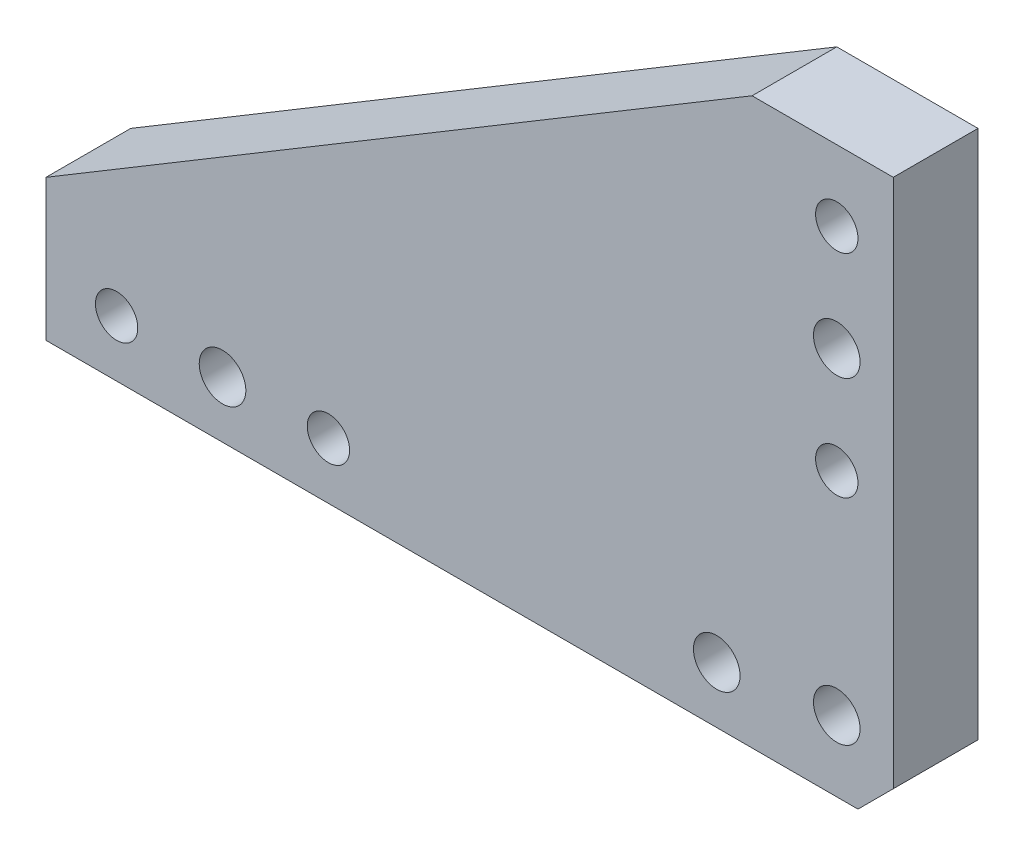
ISO-10303-21;
HEADER;
FILE_DESCRIPTION(('STEP AP214'),'2;1');
FILE_NAME('part.step','',(''),(''),'','','');
FILE_SCHEMA(('AUTOMOTIVE_DESIGN { 1 0 10303 214 1 1 1 1 }'));
ENDSEC;
DATA;
#1=APPLICATION_CONTEXT('core data for automotive mechanical design processes');
#2=APPLICATION_PROTOCOL_DEFINITION('international standard','automotive_design',2000,#1);
#3=PRODUCT_CONTEXT('',#1,'mechanical');
#4=PRODUCT('Part','Part','',(#3));
#5=PRODUCT_RELATED_PRODUCT_CATEGORY('part','',(#4));
#6=PRODUCT_DEFINITION_FORMATION('','',#4);
#7=PRODUCT_DEFINITION_CONTEXT('part definition',#1,'design');
#8=PRODUCT_DEFINITION('design','',#6,#7);
#9=PRODUCT_DEFINITION_SHAPE('','',#8);
#10=(LENGTH_UNIT() NAMED_UNIT(*) SI_UNIT(.MILLI.,.METRE.));
#11=(NAMED_UNIT(*) PLANE_ANGLE_UNIT() SI_UNIT($,.RADIAN.));
#12=(NAMED_UNIT(*) SI_UNIT($,.STERADIAN.) SOLID_ANGLE_UNIT());
#13=UNCERTAINTY_MEASURE_WITH_UNIT(LENGTH_MEASURE(1.E-05),#10,'distance_accuracy_value','');
#14=(GEOMETRIC_REPRESENTATION_CONTEXT(3) GLOBAL_UNCERTAINTY_ASSIGNED_CONTEXT((#13)) GLOBAL_UNIT_ASSIGNED_CONTEXT((#10,
#11,#12)) REPRESENTATION_CONTEXT('',''));
#15=CARTESIAN_POINT('',(0.,0.,0.));
#16=DIRECTION('',(0.,0.,1.));
#17=DIRECTION('',(1.,0.,0.));
#18=AXIS2_PLACEMENT_3D('',#15,#16,#17);
#19=CARTESIAN_POINT('',(0.,0.,12.));
#20=DIRECTION('',(0.,0.,1.));
#21=DIRECTION('',(1.,0.,0.));
#22=AXIS2_PLACEMENT_3D('',#19,#20,#21);
#23=PLANE('',#22);
#24=CARTESIAN_POINT('',(52.,15.,12.));
#25=DIRECTION('',(0.,0.,-1.));
#26=DIRECTION('',(-1.,0.,0.));
#27=AXIS2_PLACEMENT_3D('',#24,#25,#26);
#28=CIRCLE('',#27,3.3);
#29=CARTESIAN_POINT('',(48.7,15.,12.));
#30=VERTEX_POINT('',#29);
#31=EDGE_CURVE('E183',#30,#30,#28,.T.);
#32=ORIENTED_EDGE('',*,*,#31,.T.);
#33=EDGE_LOOP('',(#32));
#34=FACE_BOUND('',#33,.T.);
#35=CARTESIAN_POINT('',(52.,-30.,12.));
#36=DIRECTION('',(0.,0.,-1.));
#37=DIRECTION('',(-1.,0.,0.));
#38=AXIS2_PLACEMENT_3D('',#35,#36,#37);
#39=CIRCLE('',#38,3.3);
#40=CARTESIAN_POINT('',(48.7,-30.,12.));
#41=VERTEX_POINT('',#40);
#42=EDGE_CURVE('E177',#41,#41,#39,.T.);
#43=ORIENTED_EDGE('',*,*,#42,.T.);
#44=EDGE_LOOP('',(#43));
#45=FACE_BOUND('',#44,.T.);
#46=CARTESIAN_POINT('',(35.,-32.,12.));
#47=DIRECTION('',(0.,0.,-1.));
#48=DIRECTION('',(-1.,0.,0.));
#49=AXIS2_PLACEMENT_3D('',#46,#47,#48);
#50=CIRCLE('',#49,3.3);
#51=CARTESIAN_POINT('',(31.7,-32.,12.));
#52=VERTEX_POINT('',#51);
#53=EDGE_CURVE('E171',#52,#52,#50,.T.);
#54=ORIENTED_EDGE('',*,*,#53,.T.);
#55=EDGE_LOOP('',(#54));
#56=FACE_BOUND('',#55,.T.);
#57=DIRECTION('',(1.,0.,0.));
#58=VECTOR('',#57,1.);
#59=CARTESIAN_POINT('',(60.,-40.,12.));
#60=LINE('',#59,#58);
#61=CARTESIAN_POINT('',(-60.,-40.,12.));
#62=VERTEX_POINT('',#61);
#63=CARTESIAN_POINT('',(55.,-40.,12.));
#64=VERTEX_POINT('',#63);
#65=EDGE_CURVE('E88',#62,#64,#60,.T.);
#66=ORIENTED_EDGE('',*,*,#65,.T.);
#67=DIRECTION('',(-0.707106781186548,-0.707106781186547,0.));
#68=VECTOR('',#67,1.);
#69=CARTESIAN_POINT('',(47.4999999999999,-47.5,12.));
#70=LINE('',#69,#68);
#71=CARTESIAN_POINT('',(60.,-35.,12.));
#72=VERTEX_POINT('',#71);
#73=EDGE_CURVE('E11',#64,#72,#70,.F.);
#74=ORIENTED_EDGE('',*,*,#73,.T.);
#75=DIRECTION('',(0.,1.,0.));
#76=VECTOR('',#75,1.);
#77=CARTESIAN_POINT('',(60.,-40.,12.));
#78=LINE('',#77,#76);
#79=CARTESIAN_POINT('',(60.,40.,12.));
#80=VERTEX_POINT('',#79);
#81=EDGE_CURVE('E102',#72,#80,#78,.T.);
#82=ORIENTED_EDGE('',*,*,#81,.T.);
#83=DIRECTION('',(-1.,0.,0.));
#84=VECTOR('',#83,1.);
#85=CARTESIAN_POINT('',(60.,40.,12.));
#86=LINE('',#85,#84);
#87=CARTESIAN_POINT('',(40.0000000000006,40.,12.));
#88=VERTEX_POINT('',#87);
#89=EDGE_CURVE('E113',#80,#88,#86,.T.);
#90=ORIENTED_EDGE('',*,*,#89,.T.);
#91=DIRECTION('',(0.857492925712545,0.514495755427525,0.));
#92=VECTOR('',#91,1.);
#93=CARTESIAN_POINT('',(-7.05882352941164,11.7647058823528,12.));
#94=LINE('',#93,#92);
#95=CARTESIAN_POINT('',(-60.,-20.0000000000001,12.));
#96=VERTEX_POINT('',#95);
#97=EDGE_CURVE('E92',#88,#96,#94,.F.);
#98=ORIENTED_EDGE('',*,*,#97,.T.);
#99=DIRECTION('',(0.,-1.,0.));
#100=VECTOR('',#99,1.);
#101=CARTESIAN_POINT('',(-60.,-40.,12.));
#102=LINE('',#101,#100);
#103=EDGE_CURVE('E86',#96,#62,#102,.T.);
#104=ORIENTED_EDGE('',*,*,#103,.T.);
#105=EDGE_LOOP('',(#66,#74,#82,#90,#98,#104));
#106=FACE_BOUND('',#105,.T.);
#107=CARTESIAN_POINT('',(52.,0.,12.));
#108=DIRECTION('',(0.,0.,-1.));
#109=DIRECTION('',(-1.,0.,0.));
#110=AXIS2_PLACEMENT_3D('',#107,#108,#109);
#111=CIRCLE('',#110,3.);
#112=CARTESIAN_POINT('',(49.,0.,12.));
#113=VERTEX_POINT('',#112);
#114=EDGE_CURVE('E139',#113,#113,#111,.T.);
#115=ORIENTED_EDGE('',*,*,#114,.T.);
#116=EDGE_LOOP('',(#115));
#117=FACE_BOUND('',#116,.T.);
#118=CARTESIAN_POINT('',(52.,30.,12.));
#119=DIRECTION('',(0.,0.,-1.));
#120=DIRECTION('',(-1.,0.,0.));
#121=AXIS2_PLACEMENT_3D('',#118,#119,#120);
#122=CIRCLE('',#121,3.);
#123=CARTESIAN_POINT('',(49.,30.,12.));
#124=VERTEX_POINT('',#123);
#125=EDGE_CURVE('E147',#124,#124,#122,.T.);
#126=ORIENTED_EDGE('',*,*,#125,.T.);
#127=EDGE_LOOP('',(#126));
#128=FACE_BOUND('',#127,.T.);
#129=CARTESIAN_POINT('',(-20.,-32.,12.));
#130=DIRECTION('',(0.,0.,-1.));
#131=DIRECTION('',(-1.,0.,0.));
#132=AXIS2_PLACEMENT_3D('',#129,#130,#131);
#133=CIRCLE('',#132,3.);
#134=CARTESIAN_POINT('',(-23.,-32.,12.));
#135=VERTEX_POINT('',#134);
#136=EDGE_CURVE('E153',#135,#135,#133,.T.);
#137=ORIENTED_EDGE('',*,*,#136,.T.);
#138=EDGE_LOOP('',(#137));
#139=FACE_BOUND('',#138,.T.);
#140=CARTESIAN_POINT('',(-50.,-32.,12.));
#141=DIRECTION('',(0.,0.,-1.));
#142=DIRECTION('',(-1.,0.,0.));
#143=AXIS2_PLACEMENT_3D('',#140,#141,#142);
#144=CIRCLE('',#143,3.);
#145=CARTESIAN_POINT('',(-53.,-32.,12.));
#146=VERTEX_POINT('',#145);
#147=EDGE_CURVE('E159',#146,#146,#144,.T.);
#148=ORIENTED_EDGE('',*,*,#147,.T.);
#149=EDGE_LOOP('',(#148));
#150=FACE_BOUND('',#149,.T.);
#151=CARTESIAN_POINT('',(-35.,-32.,12.));
#152=DIRECTION('',(0.,0.,-1.));
#153=DIRECTION('',(-1.,0.,0.));
#154=AXIS2_PLACEMENT_3D('',#151,#152,#153);
#155=CIRCLE('',#154,3.3);
#156=CARTESIAN_POINT('',(-38.3,-32.,12.));
#157=VERTEX_POINT('',#156);
#158=EDGE_CURVE('E165',#157,#157,#155,.T.);
#159=ORIENTED_EDGE('',*,*,#158,.T.);
#160=EDGE_LOOP('',(#159));
#161=FACE_BOUND('',#160,.T.);
#162=ADVANCED_FACE('F34',(#34,#45,#56,#106,#117,#128,#139,#150,#161),#23,.T.);
#163=CARTESIAN_POINT('',(-60.,-40.,12.));
#164=DIRECTION('',(1.,0.,0.));
#165=DIRECTION('',(0.,0.,-1.));
#166=AXIS2_PLACEMENT_3D('',#163,#164,#165);
#167=PLANE('',#166);
#168=ORIENTED_EDGE('',*,*,#103,.F.);
#169=DIRECTION('',(0.,0.,-1.));
#170=VECTOR('',#169,1.);
#171=CARTESIAN_POINT('',(-60.,-20.0000000000001,12.));
#172=LINE('',#171,#170);
#173=CARTESIAN_POINT('',(-60.,-20.0000000000001,0.));
#174=VERTEX_POINT('',#173);
#175=EDGE_CURVE('E107',#96,#174,#172,.T.);
#176=ORIENTED_EDGE('',*,*,#175,.T.);
#177=DIRECTION('',(0.,-1.,0.));
#178=VECTOR('',#177,1.);
#179=CARTESIAN_POINT('',(-60.,-40.,0.));
#180=LINE('',#179,#178);
#181=CARTESIAN_POINT('',(-60.,-40.,0.));
#182=VERTEX_POINT('',#181);
#183=EDGE_CURVE('E106',#174,#182,#180,.T.);
#184=ORIENTED_EDGE('',*,*,#183,.T.);
#185=DIRECTION('',(0.,0.,-1.));
#186=VECTOR('',#185,1.);
#187=CARTESIAN_POINT('',(-60.,-40.,12.));
#188=LINE('',#187,#186);
#189=EDGE_CURVE('E101',#62,#182,#188,.T.);
#190=ORIENTED_EDGE('',*,*,#189,.F.);
#191=EDGE_LOOP('',(#168,#176,#184,#190));
#192=FACE_BOUND('',#191,.T.);
#193=ADVANCED_FACE('F104',(#192),#167,.F.);
#194=CARTESIAN_POINT('',(60.,-40.,12.));
#195=DIRECTION('',(0.,1.,0.));
#196=DIRECTION('',(-1.,0.,0.));
#197=AXIS2_PLACEMENT_3D('',#194,#195,#196);
#198=PLANE('',#197);
#199=DIRECTION('',(1.,0.,0.));
#200=VECTOR('',#199,1.);
#201=CARTESIAN_POINT('',(60.,-40.,0.));
#202=LINE('',#201,#200);
#203=CARTESIAN_POINT('',(55.,-40.,0.));
#204=VERTEX_POINT('',#203);
#205=EDGE_CURVE('E134',#182,#204,#202,.T.);
#206=ORIENTED_EDGE('',*,*,#205,.T.);
#207=DIRECTION('',(0.,0.,1.));
#208=VECTOR('',#207,1.);
#209=CARTESIAN_POINT('',(55.,-40.,12.));
#210=LINE('',#209,#208);
#211=EDGE_CURVE('E42',#204,#64,#210,.T.);
#212=ORIENTED_EDGE('',*,*,#211,.T.);
#213=ORIENTED_EDGE('',*,*,#65,.F.);
#214=ORIENTED_EDGE('',*,*,#189,.T.);
#215=EDGE_LOOP('',(#206,#212,#213,#214));
#216=FACE_BOUND('',#215,.T.);
#217=ADVANCED_FACE('F100',(#216),#198,.F.);
#218=CARTESIAN_POINT('',(60.,-40.,12.));
#219=DIRECTION('',(-1.,0.,0.));
#220=DIRECTION('',(0.,0.,1.));
#221=AXIS2_PLACEMENT_3D('',#218,#219,#220);
#222=PLANE('',#221);
#223=ORIENTED_EDGE('',*,*,#81,.F.);
#224=DIRECTION('',(0.,0.,-1.));
#225=VECTOR('',#224,1.);
#226=CARTESIAN_POINT('',(60.,-35.,12.));
#227=LINE('',#226,#225);
#228=CARTESIAN_POINT('',(60.,-35.,0.));
#229=VERTEX_POINT('',#228);
#230=EDGE_CURVE('E121',#72,#229,#227,.T.);
#231=ORIENTED_EDGE('',*,*,#230,.T.);
#232=DIRECTION('',(0.,1.,0.));
#233=VECTOR('',#232,1.);
#234=CARTESIAN_POINT('',(60.,-40.,0.));
#235=LINE('',#234,#233);
#236=CARTESIAN_POINT('',(60.,40.,0.));
#237=VERTEX_POINT('',#236);
#238=EDGE_CURVE('E129',#229,#237,#235,.T.);
#239=ORIENTED_EDGE('',*,*,#238,.T.);
#240=DIRECTION('',(0.,0.,-1.));
#241=VECTOR('',#240,1.);
#242=CARTESIAN_POINT('',(60.,40.,12.));
#243=LINE('',#242,#241);
#244=EDGE_CURVE('E108',#80,#237,#243,.T.);
#245=ORIENTED_EDGE('',*,*,#244,.F.);
#246=EDGE_LOOP('',(#223,#231,#239,#245));
#247=FACE_BOUND('',#246,.T.);
#248=ADVANCED_FACE('F127',(#247),#222,.F.);
#249=CARTESIAN_POINT('',(60.,40.,12.));
#250=DIRECTION('',(0.,-1.,0.));
#251=DIRECTION('',(1.,0.,0.));
#252=AXIS2_PLACEMENT_3D('',#249,#250,#251);
#253=PLANE('',#252);
#254=DIRECTION('',(-1.,0.,0.));
#255=VECTOR('',#254,1.);
#256=CARTESIAN_POINT('',(60.,40.,0.));
#257=LINE('',#256,#255);
#258=CARTESIAN_POINT('',(40.0000000000006,40.,0.));
#259=VERTEX_POINT('',#258);
#260=EDGE_CURVE('E97',#237,#259,#257,.T.);
#261=ORIENTED_EDGE('',*,*,#260,.T.);
#262=DIRECTION('',(0.,0.,1.));
#263=VECTOR('',#262,1.);
#264=CARTESIAN_POINT('',(40.0000000000006,40.,12.));
#265=LINE('',#264,#263);
#266=EDGE_CURVE('E118',#259,#88,#265,.T.);
#267=ORIENTED_EDGE('',*,*,#266,.T.);
#268=ORIENTED_EDGE('',*,*,#89,.F.);
#269=ORIENTED_EDGE('',*,*,#244,.T.);
#270=EDGE_LOOP('',(#261,#267,#268,#269));
#271=FACE_BOUND('',#270,.T.);
#272=ADVANCED_FACE('F195',(#271),#253,.F.);
#273=CARTESIAN_POINT('',(0.,0.,0.));
#274=DIRECTION('',(0.,0.,1.));
#275=DIRECTION('',(1.,0.,0.));
#276=AXIS2_PLACEMENT_3D('',#273,#274,#275);
#277=PLANE('',#276);
#278=CARTESIAN_POINT('',(52.,15.,0.));
#279=DIRECTION('',(0.,0.,-1.));
#280=DIRECTION('',(-1.,0.,0.));
#281=AXIS2_PLACEMENT_3D('',#278,#279,#280);
#282=CIRCLE('',#281,3.3);
#283=CARTESIAN_POINT('',(48.7,15.,0.));
#284=VERTEX_POINT('',#283);
#285=EDGE_CURVE('E186',#284,#284,#282,.T.);
#286=ORIENTED_EDGE('',*,*,#285,.F.);
#287=EDGE_LOOP('',(#286));
#288=FACE_BOUND('',#287,.T.);
#289=CARTESIAN_POINT('',(52.,-30.,0.));
#290=DIRECTION('',(0.,0.,-1.));
#291=DIRECTION('',(-1.,0.,0.));
#292=AXIS2_PLACEMENT_3D('',#289,#290,#291);
#293=CIRCLE('',#292,3.3);
#294=CARTESIAN_POINT('',(48.7,-30.,0.));
#295=VERTEX_POINT('',#294);
#296=EDGE_CURVE('E180',#295,#295,#293,.T.);
#297=ORIENTED_EDGE('',*,*,#296,.F.);
#298=EDGE_LOOP('',(#297));
#299=FACE_BOUND('',#298,.T.);
#300=CARTESIAN_POINT('',(35.,-32.,0.));
#301=DIRECTION('',(0.,0.,-1.));
#302=DIRECTION('',(-1.,0.,0.));
#303=AXIS2_PLACEMENT_3D('',#300,#301,#302);
#304=CIRCLE('',#303,3.3);
#305=CARTESIAN_POINT('',(31.7,-32.,0.));
#306=VERTEX_POINT('',#305);
#307=EDGE_CURVE('E174',#306,#306,#304,.T.);
#308=ORIENTED_EDGE('',*,*,#307,.F.);
#309=EDGE_LOOP('',(#308));
#310=FACE_BOUND('',#309,.T.);
#311=CARTESIAN_POINT('',(-35.,-32.,0.));
#312=DIRECTION('',(0.,0.,-1.));
#313=DIRECTION('',(-1.,0.,0.));
#314=AXIS2_PLACEMENT_3D('',#311,#312,#313);
#315=CIRCLE('',#314,3.3);
#316=CARTESIAN_POINT('',(-38.3,-32.,0.));
#317=VERTEX_POINT('',#316);
#318=EDGE_CURVE('E168',#317,#317,#315,.T.);
#319=ORIENTED_EDGE('',*,*,#318,.F.);
#320=EDGE_LOOP('',(#319));
#321=FACE_BOUND('',#320,.T.);
#322=CARTESIAN_POINT('',(-50.,-32.,0.));
#323=DIRECTION('',(0.,0.,-1.));
#324=DIRECTION('',(-1.,0.,0.));
#325=AXIS2_PLACEMENT_3D('',#322,#323,#324);
#326=CIRCLE('',#325,2.99999999999999);
#327=CARTESIAN_POINT('',(-53.,-32.,0.));
#328=VERTEX_POINT('',#327);
#329=EDGE_CURVE('E162',#328,#328,#326,.T.);
#330=ORIENTED_EDGE('',*,*,#329,.F.);
#331=EDGE_LOOP('',(#330));
#332=FACE_BOUND('',#331,.T.);
#333=CARTESIAN_POINT('',(-20.,-32.,0.));
#334=DIRECTION('',(0.,0.,-1.));
#335=DIRECTION('',(-1.,0.,0.));
#336=AXIS2_PLACEMENT_3D('',#333,#334,#335);
#337=CIRCLE('',#336,2.99999999999999);
#338=CARTESIAN_POINT('',(-23.,-32.,0.));
#339=VERTEX_POINT('',#338);
#340=EDGE_CURVE('E156',#339,#339,#337,.T.);
#341=ORIENTED_EDGE('',*,*,#340,.F.);
#342=EDGE_LOOP('',(#341));
#343=FACE_BOUND('',#342,.T.);
#344=CARTESIAN_POINT('',(52.,30.,0.));
#345=DIRECTION('',(0.,0.,-1.));
#346=DIRECTION('',(-1.,0.,0.));
#347=AXIS2_PLACEMENT_3D('',#344,#345,#346);
#348=CIRCLE('',#347,2.99999999999999);
#349=CARTESIAN_POINT('',(49.,30.,0.));
#350=VERTEX_POINT('',#349);
#351=EDGE_CURVE('E150',#350,#350,#348,.T.);
#352=ORIENTED_EDGE('',*,*,#351,.F.);
#353=EDGE_LOOP('',(#352));
#354=FACE_BOUND('',#353,.T.);
#355=CARTESIAN_POINT('',(52.,0.,0.));
#356=DIRECTION('',(0.,0.,-1.));
#357=DIRECTION('',(-1.,0.,0.));
#358=AXIS2_PLACEMENT_3D('',#355,#356,#357);
#359=CIRCLE('',#358,2.99999999999999);
#360=CARTESIAN_POINT('',(49.,0.,0.));
#361=VERTEX_POINT('',#360);
#362=EDGE_CURVE('E144',#361,#361,#359,.T.);
#363=ORIENTED_EDGE('',*,*,#362,.F.);
#364=EDGE_LOOP('',(#363));
#365=FACE_BOUND('',#364,.T.);
#366=ORIENTED_EDGE('',*,*,#238,.F.);
#367=DIRECTION('',(0.707106781186548,0.707106781186547,0.));
#368=VECTOR('',#367,1.);
#369=CARTESIAN_POINT('',(60.,-35.,0.));
#370=LINE('',#369,#368);
#371=EDGE_CURVE('E56',#229,#204,#370,.F.);
#372=ORIENTED_EDGE('',*,*,#371,.T.);
#373=ORIENTED_EDGE('',*,*,#205,.F.);
#374=ORIENTED_EDGE('',*,*,#183,.F.);
#375=DIRECTION('',(-0.857492925712545,-0.514495755427525,0.));
#376=VECTOR('',#375,1.);
#377=CARTESIAN_POINT('',(-60.,-20.0000000000001,0.));
#378=LINE('',#377,#376);
#379=EDGE_CURVE('E110',#174,#259,#378,.F.);
#380=ORIENTED_EDGE('',*,*,#379,.T.);
#381=ORIENTED_EDGE('',*,*,#260,.F.);
#382=EDGE_LOOP('',(#366,#372,#373,#374,#380,#381));
#383=FACE_BOUND('',#382,.T.);
#384=ADVANCED_FACE('F132',(#288,#299,#310,#321,#332,#343,#354,#365,#383),#277,.F.);
#385=CARTESIAN_POINT('',(-60.,-20.0000000000001,12.));
#386=DIRECTION('',(0.514495755427525,-0.857492925712545,0.));
#387=DIRECTION('',(0.,0.,-1.));
#388=AXIS2_PLACEMENT_3D('',#385,#386,#387);
#389=PLANE('',#388);
#390=ORIENTED_EDGE('',*,*,#97,.F.);
#391=ORIENTED_EDGE('',*,*,#266,.F.);
#392=ORIENTED_EDGE('',*,*,#379,.F.);
#393=ORIENTED_EDGE('',*,*,#175,.F.);
#394=EDGE_LOOP('',(#390,#391,#392,#393));
#395=FACE_BOUND('',#394,.T.);
#396=ADVANCED_FACE('F194',(#395),#389,.F.);
#397=CARTESIAN_POINT('',(60.,-35.,12.));
#398=DIRECTION('',(-0.707106781186547,0.707106781186548,0.));
#399=DIRECTION('',(0.,0.,-1.));
#400=AXIS2_PLACEMENT_3D('',#397,#398,#399);
#401=PLANE('',#400);
#402=ORIENTED_EDGE('',*,*,#73,.F.);
#403=ORIENTED_EDGE('',*,*,#211,.F.);
#404=ORIENTED_EDGE('',*,*,#371,.F.);
#405=ORIENTED_EDGE('',*,*,#230,.F.);
#406=EDGE_LOOP('',(#402,#403,#404,#405));
#407=FACE_BOUND('',#406,.T.);
#408=ADVANCED_FACE('F36',(#407),#401,.F.);
#409=CARTESIAN_POINT('',(52.,0.,0.));
#410=DIRECTION('',(0.,0.,-1.));
#411=DIRECTION('',(-1.,0.,0.));
#412=AXIS2_PLACEMENT_3D('',#409,#410,#411);
#413=CYLINDRICAL_SURFACE('',#412,2.99999999999999);
#414=ORIENTED_EDGE('',*,*,#114,.F.);
#415=EDGE_LOOP('',(#414));
#416=FACE_BOUND('',#415,.T.);
#417=ORIENTED_EDGE('',*,*,#362,.T.);
#418=EDGE_LOOP('',(#417));
#419=FACE_BOUND('',#418,.T.);
#420=ADVANCED_FACE('F211',(#416,#419),#413,.F.);
#421=CARTESIAN_POINT('',(52.,30.,0.));
#422=DIRECTION('',(0.,0.,-1.));
#423=DIRECTION('',(-1.,0.,0.));
#424=AXIS2_PLACEMENT_3D('',#421,#422,#423);
#425=CYLINDRICAL_SURFACE('',#424,2.99999999999999);
#426=ORIENTED_EDGE('',*,*,#125,.F.);
#427=EDGE_LOOP('',(#426));
#428=FACE_BOUND('',#427,.T.);
#429=ORIENTED_EDGE('',*,*,#351,.T.);
#430=EDGE_LOOP('',(#429));
#431=FACE_BOUND('',#430,.T.);
#432=ADVANCED_FACE('F213',(#428,#431),#425,.F.);
#433=CARTESIAN_POINT('',(-20.,-32.,0.));
#434=DIRECTION('',(0.,0.,-1.));
#435=DIRECTION('',(-1.,0.,0.));
#436=AXIS2_PLACEMENT_3D('',#433,#434,#435);
#437=CYLINDRICAL_SURFACE('',#436,2.99999999999999);
#438=ORIENTED_EDGE('',*,*,#136,.F.);
#439=EDGE_LOOP('',(#438));
#440=FACE_BOUND('',#439,.T.);
#441=ORIENTED_EDGE('',*,*,#340,.T.);
#442=EDGE_LOOP('',(#441));
#443=FACE_BOUND('',#442,.T.);
#444=ADVANCED_FACE('F220',(#440,#443),#437,.F.);
#445=CARTESIAN_POINT('',(-50.,-32.,0.));
#446=DIRECTION('',(0.,0.,-1.));
#447=DIRECTION('',(-1.,0.,0.));
#448=AXIS2_PLACEMENT_3D('',#445,#446,#447);
#449=CYLINDRICAL_SURFACE('',#448,2.99999999999999);
#450=ORIENTED_EDGE('',*,*,#147,.F.);
#451=EDGE_LOOP('',(#450));
#452=FACE_BOUND('',#451,.T.);
#453=ORIENTED_EDGE('',*,*,#329,.T.);
#454=EDGE_LOOP('',(#453));
#455=FACE_BOUND('',#454,.T.);
#456=ADVANCED_FACE('F276',(#452,#455),#449,.F.);
#457=CARTESIAN_POINT('',(-35.,-32.,0.));
#458=DIRECTION('',(0.,0.,-1.));
#459=DIRECTION('',(-1.,0.,0.));
#460=AXIS2_PLACEMENT_3D('',#457,#458,#459);
#461=CYLINDRICAL_SURFACE('',#460,3.3);
#462=ORIENTED_EDGE('',*,*,#158,.F.);
#463=EDGE_LOOP('',(#462));
#464=FACE_BOUND('',#463,.T.);
#465=ORIENTED_EDGE('',*,*,#318,.T.);
#466=EDGE_LOOP('',(#465));
#467=FACE_BOUND('',#466,.T.);
#468=ADVANCED_FACE('F285',(#464,#467),#461,.F.);
#469=CARTESIAN_POINT('',(35.,-32.,0.));
#470=DIRECTION('',(0.,0.,-1.));
#471=DIRECTION('',(-1.,0.,0.));
#472=AXIS2_PLACEMENT_3D('',#469,#470,#471);
#473=CYLINDRICAL_SURFACE('',#472,3.3);
#474=ORIENTED_EDGE('',*,*,#53,.F.);
#475=EDGE_LOOP('',(#474));
#476=FACE_BOUND('',#475,.T.);
#477=ORIENTED_EDGE('',*,*,#307,.T.);
#478=EDGE_LOOP('',(#477));
#479=FACE_BOUND('',#478,.T.);
#480=ADVANCED_FACE('F300',(#476,#479),#473,.F.);
#481=CARTESIAN_POINT('',(52.,-30.,0.));
#482=DIRECTION('',(0.,0.,-1.));
#483=DIRECTION('',(-1.,0.,0.));
#484=AXIS2_PLACEMENT_3D('',#481,#482,#483);
#485=CYLINDRICAL_SURFACE('',#484,3.3);
#486=ORIENTED_EDGE('',*,*,#42,.F.);
#487=EDGE_LOOP('',(#486));
#488=FACE_BOUND('',#487,.T.);
#489=ORIENTED_EDGE('',*,*,#296,.T.);
#490=EDGE_LOOP('',(#489));
#491=FACE_BOUND('',#490,.T.);
#492=ADVANCED_FACE('F307',(#488,#491),#485,.F.);
#493=CARTESIAN_POINT('',(52.,15.,0.));
#494=DIRECTION('',(0.,0.,-1.));
#495=DIRECTION('',(-1.,0.,0.));
#496=AXIS2_PLACEMENT_3D('',#493,#494,#495);
#497=CYLINDRICAL_SURFACE('',#496,3.3);
#498=ORIENTED_EDGE('',*,*,#31,.F.);
#499=EDGE_LOOP('',(#498));
#500=FACE_BOUND('',#499,.T.);
#501=ORIENTED_EDGE('',*,*,#285,.T.);
#502=EDGE_LOOP('',(#501));
#503=FACE_BOUND('',#502,.T.);
#504=ADVANCED_FACE('F190',(#500,#503),#497,.F.);
#505=CLOSED_SHELL('',(#162,#193,#217,#248,#272,#384,#396,#408,#420,#432,#444,#456,#468,#480,
#492,#504));
#506=MANIFOLD_SOLID_BREP('B2',#505);
#507=ADVANCED_BREP_SHAPE_REPRESENTATION('',(#18,#506),#14);
#508=SHAPE_DEFINITION_REPRESENTATION(#9,#507);
ENDSEC;
END-ISO-10303-21;
